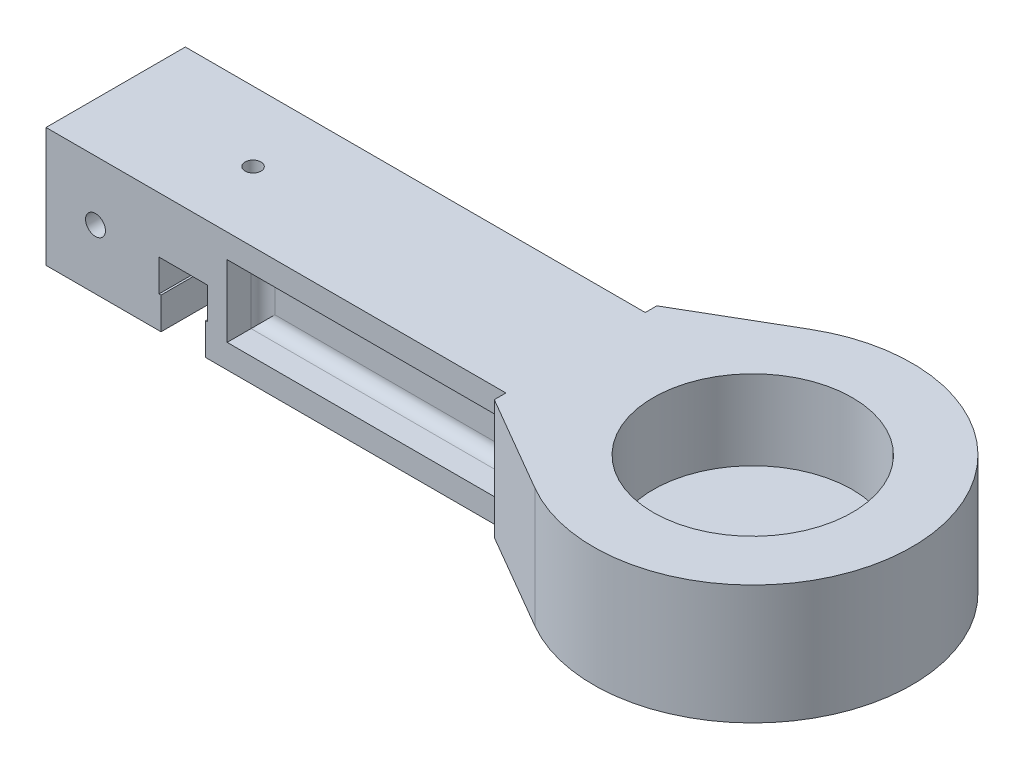
ISO-10303-21;
HEADER;
FILE_DESCRIPTION(('STEP AP214'),'2;1');
FILE_NAME('part.step','',(''),(''),'','','');
FILE_SCHEMA(('AUTOMOTIVE_DESIGN { 1 0 10303 214 1 1 1 1 }'));
ENDSEC;
DATA;
#1=APPLICATION_CONTEXT('core data for automotive mechanical design processes');
#2=APPLICATION_PROTOCOL_DEFINITION('international standard','automotive_design',2000,#1);
#3=PRODUCT_CONTEXT('',#1,'mechanical');
#4=PRODUCT('Part','Part','',(#3));
#5=PRODUCT_RELATED_PRODUCT_CATEGORY('part','',(#4));
#6=PRODUCT_DEFINITION_FORMATION('','',#4);
#7=PRODUCT_DEFINITION_CONTEXT('part definition',#1,'design');
#8=PRODUCT_DEFINITION('design','',#6,#7);
#9=PRODUCT_DEFINITION_SHAPE('','',#8);
#10=(LENGTH_UNIT() NAMED_UNIT(*) SI_UNIT(.MILLI.,.METRE.));
#11=(NAMED_UNIT(*) PLANE_ANGLE_UNIT() SI_UNIT($,.RADIAN.));
#12=(NAMED_UNIT(*) SI_UNIT($,.STERADIAN.) SOLID_ANGLE_UNIT());
#13=UNCERTAINTY_MEASURE_WITH_UNIT(LENGTH_MEASURE(1.E-05),#10,'distance_accuracy_value','');
#14=(GEOMETRIC_REPRESENTATION_CONTEXT(3) GLOBAL_UNCERTAINTY_ASSIGNED_CONTEXT((#13)) GLOBAL_UNIT_ASSIGNED_CONTEXT((#10,
#11,#12)) REPRESENTATION_CONTEXT('',''));
#15=CARTESIAN_POINT('',(0.,0.,0.));
#16=DIRECTION('',(0.,0.,1.));
#17=DIRECTION('',(1.,0.,0.));
#18=AXIS2_PLACEMENT_3D('',#15,#16,#17);
#19=CARTESIAN_POINT('',(-55.4989459475582,91.5559696739877,-40.0100000000001));
#20=DIRECTION('',(-1.,0.,0.));
#21=DIRECTION('',(0.,-1.,0.));
#22=AXIS2_PLACEMENT_3D('',#19,#20,#21);
#23=PLANE('',#22);
#24=DIRECTION('',(0.,1.,0.));
#25=VECTOR('',#24,1.);
#26=CARTESIAN_POINT('',(-55.4989459475582,30.,17.5));
#27=LINE('',#26,#25);
#28=CARTESIAN_POINT('',(-55.4989459475582,0.,17.5));
#29=VERTEX_POINT('',#28);
#30=CARTESIAN_POINT('',(-55.4989459475582,30.,17.5));
#31=VERTEX_POINT('',#30);
#32=EDGE_CURVE('E383',#29,#31,#27,.T.);
#33=ORIENTED_EDGE('',*,*,#32,.T.);
#34=DIRECTION('',(0.,0.,-1.));
#35=VECTOR('',#34,1.);
#36=CARTESIAN_POINT('',(-55.4989459475582,30.,0.));
#37=LINE('',#36,#35);
#38=CARTESIAN_POINT('',(-55.4989459475582,30.,-17.5));
#39=VERTEX_POINT('',#38);
#40=EDGE_CURVE('E269',#31,#39,#37,.T.);
#41=ORIENTED_EDGE('',*,*,#40,.T.);
#42=DIRECTION('',(0.,1.,0.));
#43=VECTOR('',#42,1.);
#44=CARTESIAN_POINT('',(-55.4989459475582,30.,-17.5));
#45=LINE('',#44,#43);
#46=CARTESIAN_POINT('',(-55.4989459475582,0.,-17.5));
#47=VERTEX_POINT('',#46);
#48=EDGE_CURVE('E380',#47,#39,#45,.T.);
#49=ORIENTED_EDGE('',*,*,#48,.F.);
#50=DIRECTION('',(0.,0.,-1.));
#51=VECTOR('',#50,1.);
#52=CARTESIAN_POINT('',(-55.4989459475582,0.,0.));
#53=LINE('',#52,#51);
#54=EDGE_CURVE('E280',#29,#47,#53,.T.);
#55=ORIENTED_EDGE('',*,*,#54,.F.);
#56=EDGE_LOOP('',(#33,#41,#49,#55));
#57=FACE_BOUND('',#56,.T.);
#58=ADVANCED_FACE('F33',(#57),#23,.T.);
#59=CARTESIAN_POINT('',(-21.,8.,-7.04367328411343));
#60=DIRECTION('',(-0.5,0.,-0.866025403784439));
#61=DIRECTION('',(-0.866025403784439,0.,0.5));
#62=AXIS2_PLACEMENT_3D('',#59,#60,#61);
#63=PLANE('',#62);
#64=DIRECTION('',(0.,1.,0.));
#65=VECTOR('',#64,1.);
#66=CARTESIAN_POINT('',(-21.,8.,-7.04367328411343));
#67=LINE('',#66,#65);
#68=CARTESIAN_POINT('',(-21.,8.,-7.04367328411343));
#69=VERTEX_POINT('',#68);
#70=CARTESIAN_POINT('',(-21.,16.,-7.04367328411343));
#71=VERTEX_POINT('',#70);
#72=EDGE_CURVE('E293',#69,#71,#67,.T.);
#73=ORIENTED_EDGE('',*,*,#72,.T.);
#74=DIRECTION('',(-0.866025403784439,0.,0.5));
#75=VECTOR('',#74,1.);
#76=CARTESIAN_POINT('',(-21.,16.,-7.04367328411343));
#77=LINE('',#76,#75);
#78=CARTESIAN_POINT('',(-27.1,16.,-3.52183664205672));
#79=VERTEX_POINT('',#78);
#80=EDGE_CURVE('E311',#71,#79,#77,.T.);
#81=ORIENTED_EDGE('',*,*,#80,.T.);
#82=DIRECTION('',(0.,1.,0.));
#83=VECTOR('',#82,1.);
#84=CARTESIAN_POINT('',(-27.1,8.,-3.52183664205672));
#85=LINE('',#84,#83);
#86=CARTESIAN_POINT('',(-27.1,8.,-3.52183664205672));
#87=VERTEX_POINT('',#86);
#88=EDGE_CURVE('E284',#87,#79,#85,.T.);
#89=ORIENTED_EDGE('',*,*,#88,.F.);
#90=DIRECTION('',(-0.866025403784439,0.,0.5));
#91=VECTOR('',#90,1.);
#92=CARTESIAN_POINT('',(-21.,8.,-7.04367328411343));
#93=LINE('',#92,#91);
#94=EDGE_CURVE('E299',#69,#87,#93,.T.);
#95=ORIENTED_EDGE('',*,*,#94,.F.);
#96=EDGE_LOOP('',(#73,#81,#89,#95));
#97=FACE_BOUND('',#96,.T.);
#98=ADVANCED_FACE('F488',(#97),#63,.F.);
#99=CARTESIAN_POINT('',(-14.9,8.,-3.52183664205671));
#100=DIRECTION('',(0.5,0.,-0.866025403784439));
#101=DIRECTION('',(-0.866025403784439,0.,-0.5));
#102=AXIS2_PLACEMENT_3D('',#99,#100,#101);
#103=PLANE('',#102);
#104=DIRECTION('',(0.,1.,0.));
#105=VECTOR('',#104,1.);
#106=CARTESIAN_POINT('',(-14.9,8.,-3.52183664205671));
#107=LINE('',#106,#105);
#108=CARTESIAN_POINT('',(-14.9,8.,-3.52183664205671));
#109=VERTEX_POINT('',#108);
#110=CARTESIAN_POINT('',(-14.9,16.,-3.52183664205671));
#111=VERTEX_POINT('',#110);
#112=EDGE_CURVE('E289',#109,#111,#107,.T.);
#113=ORIENTED_EDGE('',*,*,#112,.T.);
#114=DIRECTION('',(-0.866025403784439,0.,-0.5));
#115=VECTOR('',#114,1.);
#116=CARTESIAN_POINT('',(-14.9,16.,-3.52183664205671));
#117=LINE('',#116,#115);
#118=EDGE_CURVE('E276',#111,#71,#117,.T.);
#119=ORIENTED_EDGE('',*,*,#118,.T.);
#120=ORIENTED_EDGE('',*,*,#72,.F.);
#121=DIRECTION('',(-0.866025403784439,0.,-0.5));
#122=VECTOR('',#121,1.);
#123=CARTESIAN_POINT('',(-14.9,8.,-3.52183664205671));
#124=LINE('',#123,#122);
#125=EDGE_CURVE('E302',#109,#69,#124,.T.);
#126=ORIENTED_EDGE('',*,*,#125,.F.);
#127=EDGE_LOOP('',(#113,#119,#120,#126));
#128=FACE_BOUND('',#127,.T.);
#129=ADVANCED_FACE('F490',(#128),#103,.F.);
#130=CARTESIAN_POINT('',(104.501054052442,10.,0.));
#131=DIRECTION('',(0.,1.,0.));
#132=DIRECTION('',(0.,0.,1.));
#133=AXIS2_PLACEMENT_3D('',#130,#131,#132);
#134=PLANE('',#133);
#135=CARTESIAN_POINT('',(104.501054052442,10.,0.));
#136=DIRECTION('',(0.,1.,0.));
#137=DIRECTION('',(0.,0.,1.));
#138=AXIS2_PLACEMENT_3D('',#135,#136,#137);
#139=CIRCLE('',#138,25.);
#140=CARTESIAN_POINT('',(104.501054052442,10.,25.));
#141=VERTEX_POINT('',#140);
#142=EDGE_CURVE('E366',#141,#141,#139,.T.);
#143=ORIENTED_EDGE('',*,*,#142,.T.);
#144=EDGE_LOOP('',(#143));
#145=FACE_BOUND('',#144,.T.);
#146=ADVANCED_FACE('F497',(#145),#134,.T.);
#147=CARTESIAN_POINT('',(-14.9,8.,3.52183664205672));
#148=DIRECTION('',(1.,0.,0.));
#149=DIRECTION('',(0.,0.,-1.));
#150=AXIS2_PLACEMENT_3D('',#147,#148,#149);
#151=PLANE('',#150);
#152=DIRECTION('',(0.,0.,-1.));
#153=VECTOR('',#152,1.);
#154=CARTESIAN_POINT('',(-14.9,16.,3.52183664205672));
#155=LINE('',#154,#153);
#156=CARTESIAN_POINT('',(-14.9,16.,17.5));
#157=VERTEX_POINT('',#156);
#158=EDGE_CURVE('E307',#157,#111,#155,.T.);
#159=ORIENTED_EDGE('',*,*,#158,.T.);
#160=ORIENTED_EDGE('',*,*,#112,.F.);
#161=DIRECTION('',(0.,0.,-1.));
#162=VECTOR('',#161,1.);
#163=CARTESIAN_POINT('',(-14.9,8.,3.52183664205672));
#164=LINE('',#163,#162);
#165=CARTESIAN_POINT('',(-14.9,8.,17.5));
#166=VERTEX_POINT('',#165);
#167=EDGE_CURVE('E305',#166,#109,#164,.T.);
#168=ORIENTED_EDGE('',*,*,#167,.F.);
#169=DIRECTION('',(0.,1.,0.));
#170=VECTOR('',#169,1.);
#171=CARTESIAN_POINT('',(-14.9,8.,17.5));
#172=LINE('',#171,#170);
#173=EDGE_CURVE('E327',#166,#157,#172,.T.);
#174=ORIENTED_EDGE('',*,*,#173,.T.);
#175=EDGE_LOOP('',(#159,#160,#168,#174));
#176=FACE_BOUND('',#175,.T.);
#177=ADVANCED_FACE('F518',(#176),#151,.F.);
#178=CARTESIAN_POINT('',(-38.,16.,11.0434775432545));
#179=DIRECTION('',(0.,-1.,0.));
#180=DIRECTION('',(0.,0.,-1.));
#181=AXIS2_PLACEMENT_3D('',#178,#179,#180);
#182=PLANE('',#181);
#183=CARTESIAN_POINT('',(-21.,16.,0.));
#184=DIRECTION('',(0.,-1.,0.));
#185=DIRECTION('',(0.,0.,-1.));
#186=AXIS2_PLACEMENT_3D('',#183,#184,#185);
#187=CIRCLE('',#186,2.);
#188=CARTESIAN_POINT('',(-21.,16.,-2.));
#189=VERTEX_POINT('',#188);
#190=EDGE_CURVE('E271',#189,#189,#187,.T.);
#191=ORIENTED_EDGE('',*,*,#190,.F.);
#192=EDGE_LOOP('',(#191));
#193=FACE_BOUND('',#192,.T.);
#194=ORIENTED_EDGE('',*,*,#158,.F.);
#195=DIRECTION('',(-1.,0.,0.));
#196=VECTOR('',#195,1.);
#197=CARTESIAN_POINT('',(-21.,16.,17.5));
#198=LINE('',#197,#196);
#199=CARTESIAN_POINT('',(-27.1,16.,17.5));
#200=VERTEX_POINT('',#199);
#201=EDGE_CURVE('E324',#157,#200,#198,.T.);
#202=ORIENTED_EDGE('',*,*,#201,.T.);
#203=DIRECTION('',(0.,0.,1.));
#204=VECTOR('',#203,1.);
#205=CARTESIAN_POINT('',(-27.1,16.,-3.52183664205672));
#206=LINE('',#205,#204);
#207=EDGE_CURVE('E309',#79,#200,#206,.T.);
#208=ORIENTED_EDGE('',*,*,#207,.F.);
#209=ORIENTED_EDGE('',*,*,#80,.F.);
#210=ORIENTED_EDGE('',*,*,#118,.F.);
#211=EDGE_LOOP('',(#194,#202,#208,#209,#210));
#212=FACE_BOUND('',#211,.T.);
#213=ADVANCED_FACE('F510',(#193,#212),#182,.T.);
#214=CARTESIAN_POINT('',(-27.1,8.,-3.52183664205672));
#215=DIRECTION('',(-1.,0.,0.));
#216=DIRECTION('',(0.,0.,1.));
#217=AXIS2_PLACEMENT_3D('',#214,#215,#216);
#218=PLANE('',#217);
#219=DIRECTION('',(0.,-1.,0.));
#220=VECTOR('',#219,1.);
#221=CARTESIAN_POINT('',(-27.1,8.,17.5));
#222=LINE('',#221,#220);
#223=CARTESIAN_POINT('',(-27.1,8.,17.5));
#224=VERTEX_POINT('',#223);
#225=EDGE_CURVE('E275',#200,#224,#222,.T.);
#226=ORIENTED_EDGE('',*,*,#225,.T.);
#227=DIRECTION('',(0.,0.,1.));
#228=VECTOR('',#227,1.);
#229=CARTESIAN_POINT('',(-27.1,8.,-3.52183664205672));
#230=LINE('',#229,#228);
#231=EDGE_CURVE('E292',#87,#224,#230,.T.);
#232=ORIENTED_EDGE('',*,*,#231,.F.);
#233=ORIENTED_EDGE('',*,*,#88,.T.);
#234=ORIENTED_EDGE('',*,*,#207,.T.);
#235=EDGE_LOOP('',(#226,#232,#233,#234));
#236=FACE_BOUND('',#235,.T.);
#237=ADVANCED_FACE('F506',(#236),#218,.F.);
#238=CARTESIAN_POINT('',(0.,8.,0.));
#239=DIRECTION('',(0.,1.,0.));
#240=DIRECTION('',(0.,0.,1.));
#241=AXIS2_PLACEMENT_3D('',#238,#239,#240);
#242=PLANE('',#241);
#243=DIRECTION('',(0.,0.,1.));
#244=VECTOR('',#243,1.);
#245=CARTESIAN_POINT('',(-15.4,8.,0.));
#246=LINE('',#245,#244);
#247=CARTESIAN_POINT('',(-15.4,8.,0.));
#248=VERTEX_POINT('',#247);
#249=CARTESIAN_POINT('',(-15.4,8.,17.5));
#250=VERTEX_POINT('',#249);
#251=EDGE_CURVE('E314',#248,#250,#246,.T.);
#252=ORIENTED_EDGE('',*,*,#251,.T.);
#253=DIRECTION('',(1.,0.,0.));
#254=VECTOR('',#253,1.);
#255=CARTESIAN_POINT('',(-15.4,8.,17.5));
#256=LINE('',#255,#254);
#257=EDGE_CURVE('E331',#250,#166,#256,.T.);
#258=ORIENTED_EDGE('',*,*,#257,.T.);
#259=ORIENTED_EDGE('',*,*,#167,.T.);
#260=ORIENTED_EDGE('',*,*,#125,.T.);
#261=ORIENTED_EDGE('',*,*,#94,.T.);
#262=ORIENTED_EDGE('',*,*,#231,.T.);
#263=DIRECTION('',(1.,0.,0.));
#264=VECTOR('',#263,1.);
#265=CARTESIAN_POINT('',(-27.1,8.,17.5));
#266=LINE('',#265,#264);
#267=CARTESIAN_POINT('',(-26.6,8.,17.5));
#268=VERTEX_POINT('',#267);
#269=EDGE_CURVE('E340',#224,#268,#266,.T.);
#270=ORIENTED_EDGE('',*,*,#269,.T.);
#271=DIRECTION('',(0.,0.,1.));
#272=VECTOR('',#271,1.);
#273=CARTESIAN_POINT('',(-26.6,8.,0.));
#274=LINE('',#273,#272);
#275=CARTESIAN_POINT('',(-26.6,8.,0.));
#276=VERTEX_POINT('',#275);
#277=EDGE_CURVE('E315',#276,#268,#274,.T.);
#278=ORIENTED_EDGE('',*,*,#277,.F.);
#279=CARTESIAN_POINT('',(-21.,8.,0.));
#280=DIRECTION('',(0.,1.,0.));
#281=DIRECTION('',(0.,0.,1.));
#282=AXIS2_PLACEMENT_3D('',#279,#280,#281);
#283=CIRCLE('',#282,5.6);
#284=EDGE_CURVE('E281',#276,#248,#283,.F.);
#285=ORIENTED_EDGE('',*,*,#284,.T.);
#286=EDGE_LOOP('',(#252,#258,#259,#260,#261,#262,#270,#278,#285));
#287=FACE_BOUND('',#286,.T.);
#288=ADVANCED_FACE('F509',(#287),#242,.T.);
#289=CARTESIAN_POINT('',(-26.6,8.,0.));
#290=DIRECTION('',(-1.,0.,0.));
#291=DIRECTION('',(0.,0.,1.));
#292=AXIS2_PLACEMENT_3D('',#289,#290,#291);
#293=PLANE('',#292);
#294=DIRECTION('',(0.,-1.,0.));
#295=VECTOR('',#294,1.);
#296=CARTESIAN_POINT('',(-26.6,8.,17.5));
#297=LINE('',#296,#295);
#298=CARTESIAN_POINT('',(-26.6,0.,17.5));
#299=VERTEX_POINT('',#298);
#300=EDGE_CURVE('E337',#268,#299,#297,.T.);
#301=ORIENTED_EDGE('',*,*,#300,.T.);
#302=DIRECTION('',(0.,0.,1.));
#303=VECTOR('',#302,1.);
#304=CARTESIAN_POINT('',(-26.6,0.,0.));
#305=LINE('',#304,#303);
#306=CARTESIAN_POINT('',(-26.6,0.,0.));
#307=VERTEX_POINT('',#306);
#308=EDGE_CURVE('E318',#307,#299,#305,.T.);
#309=ORIENTED_EDGE('',*,*,#308,.F.);
#310=DIRECTION('',(0.,-1.,0.));
#311=VECTOR('',#310,1.);
#312=CARTESIAN_POINT('',(-26.6,8.,0.));
#313=LINE('',#312,#311);
#314=EDGE_CURVE('E328',#276,#307,#313,.T.);
#315=ORIENTED_EDGE('',*,*,#314,.F.);
#316=ORIENTED_EDGE('',*,*,#277,.T.);
#317=EDGE_LOOP('',(#301,#309,#315,#316));
#318=FACE_BOUND('',#317,.T.);
#319=ADVANCED_FACE('F514',(#318),#293,.F.);
#320=CARTESIAN_POINT('',(-21.,30.,0.));
#321=DIRECTION('',(0.,-1.,0.));
#322=DIRECTION('',(0.,0.,-1.));
#323=AXIS2_PLACEMENT_3D('',#320,#321,#322);
#324=CYLINDRICAL_SURFACE('',#323,5.6);
#325=ORIENTED_EDGE('',*,*,#314,.T.);
#326=CARTESIAN_POINT('',(-21.,0.,0.));
#327=DIRECTION('',(0.,-1.,0.));
#328=DIRECTION('',(0.,0.,-1.));
#329=AXIS2_PLACEMENT_3D('',#326,#327,#328);
#330=CIRCLE('',#329,5.6);
#331=CARTESIAN_POINT('',(-15.4,0.,0.));
#332=VERTEX_POINT('',#331);
#333=EDGE_CURVE('E285',#307,#332,#330,.T.);
#334=ORIENTED_EDGE('',*,*,#333,.T.);
#335=DIRECTION('',(0.,1.,0.));
#336=VECTOR('',#335,1.);
#337=CARTESIAN_POINT('',(-15.4,0.,0.));
#338=LINE('',#337,#336);
#339=EDGE_CURVE('E317',#332,#248,#338,.T.);
#340=ORIENTED_EDGE('',*,*,#339,.T.);
#341=ORIENTED_EDGE('',*,*,#284,.F.);
#342=EDGE_LOOP('',(#325,#334,#340,#341));
#343=FACE_BOUND('',#342,.T.);
#344=ADVANCED_FACE('F522',(#343),#324,.F.);
#345=CARTESIAN_POINT('',(-15.4,0.,0.));
#346=DIRECTION('',(1.,0.,0.));
#347=DIRECTION('',(0.,0.,-1.));
#348=AXIS2_PLACEMENT_3D('',#345,#346,#347);
#349=PLANE('',#348);
#350=DIRECTION('',(0.,1.,0.));
#351=VECTOR('',#350,1.);
#352=CARTESIAN_POINT('',(-15.4,0.,17.5));
#353=LINE('',#352,#351);
#354=CARTESIAN_POINT('',(-15.4,0.,17.5));
#355=VERTEX_POINT('',#354);
#356=EDGE_CURVE('E334',#355,#250,#353,.T.);
#357=ORIENTED_EDGE('',*,*,#356,.T.);
#358=ORIENTED_EDGE('',*,*,#251,.F.);
#359=ORIENTED_EDGE('',*,*,#339,.F.);
#360=DIRECTION('',(0.,0.,1.));
#361=VECTOR('',#360,1.);
#362=CARTESIAN_POINT('',(-15.4,0.,0.));
#363=LINE('',#362,#361);
#364=EDGE_CURVE('E321',#332,#355,#363,.T.);
#365=ORIENTED_EDGE('',*,*,#364,.T.);
#366=EDGE_LOOP('',(#357,#358,#359,#365));
#367=FACE_BOUND('',#366,.T.);
#368=ADVANCED_FACE('F524',(#367),#349,.F.);
#369=CARTESIAN_POINT('',(55.,0.,17.4999999999999));
#370=DIRECTION('',(-0.50238861787355,0.,0.864641935503422));
#371=DIRECTION('',(0.864641935503422,0.,0.50238861787355));
#372=AXIS2_PLACEMENT_3D('',#369,#370,#371);
#373=PLANE('',#372);
#374=DIRECTION('',(0.,1.,0.));
#375=VECTOR('',#374,1.);
#376=CARTESIAN_POINT('',(60.,0.,20.4051830430884));
#377=LINE('',#376,#375);
#378=CARTESIAN_POINT('',(60.,0.,20.4051830430884));
#379=VERTEX_POINT('',#378);
#380=CARTESIAN_POINT('',(60.,30.,20.4051830430884));
#381=VERTEX_POINT('',#380);
#382=EDGE_CURVE('E256',#379,#381,#377,.T.);
#383=ORIENTED_EDGE('',*,*,#382,.F.);
#384=DIRECTION('',(0.864641935503422,0.,0.50238861787355));
#385=VECTOR('',#384,1.);
#386=CARTESIAN_POINT('',(55.,0.,17.4999999999999));
#387=LINE('',#386,#385);
#388=CARTESIAN_POINT('',(84.4055093374998,0.,34.5856774201368));
#389=VERTEX_POINT('',#388);
#390=EDGE_CURVE('E369',#379,#389,#387,.T.);
#391=ORIENTED_EDGE('',*,*,#390,.T.);
#392=DIRECTION('',(0.,1.,0.));
#393=VECTOR('',#392,1.);
#394=CARTESIAN_POINT('',(84.4055093374998,0.,34.5856774201368));
#395=LINE('',#394,#393);
#396=CARTESIAN_POINT('',(84.4055093374998,30.,34.5856774201368));
#397=VERTEX_POINT('',#396);
#398=EDGE_CURVE('E352',#389,#397,#395,.T.);
#399=ORIENTED_EDGE('',*,*,#398,.T.);
#400=DIRECTION('',(0.864641935503422,0.,0.50238861787355));
#401=VECTOR('',#400,1.);
#402=CARTESIAN_POINT('',(55.,30.,17.4999999999999));
#403=LINE('',#402,#401);
#404=EDGE_CURVE('E360',#381,#397,#403,.T.);
#405=ORIENTED_EDGE('',*,*,#404,.F.);
#406=EDGE_LOOP('',(#383,#391,#399,#405));
#407=FACE_BOUND('',#406,.T.);
#408=ADVANCED_FACE('F527',(#407),#373,.T.);
#409=CARTESIAN_POINT('',(104.501054052442,0.,0.));
#410=DIRECTION('',(0.,1.,0.));
#411=DIRECTION('',(0.,0.,1.));
#412=AXIS2_PLACEMENT_3D('',#409,#410,#411);
#413=CYLINDRICAL_SURFACE('',#412,40.);
#414=CARTESIAN_POINT('',(104.501054052442,30.,0.));
#415=DIRECTION('',(0.,1.,0.));
#416=DIRECTION('',(0.,0.,1.));
#417=AXIS2_PLACEMENT_3D('',#414,#415,#416);
#418=CIRCLE('',#417,40.);
#419=CARTESIAN_POINT('',(84.4055093374998,30.,-34.5856774201369));
#420=VERTEX_POINT('',#419);
#421=EDGE_CURVE('E357',#397,#420,#418,.T.);
#422=ORIENTED_EDGE('',*,*,#421,.F.);
#423=ORIENTED_EDGE('',*,*,#398,.F.);
#424=CARTESIAN_POINT('',(104.501054052442,0.,0.));
#425=DIRECTION('',(0.,1.,0.));
#426=DIRECTION('',(0.,0.,1.));
#427=AXIS2_PLACEMENT_3D('',#424,#425,#426);
#428=CIRCLE('',#427,40.);
#429=CARTESIAN_POINT('',(84.4055093374998,0.,-34.5856774201369));
#430=VERTEX_POINT('',#429);
#431=EDGE_CURVE('E355',#389,#430,#428,.T.);
#432=ORIENTED_EDGE('',*,*,#431,.T.);
#433=DIRECTION('',(0.,1.,0.));
#434=VECTOR('',#433,1.);
#435=CARTESIAN_POINT('',(84.4055093374998,0.,-34.5856774201369));
#436=LINE('',#435,#434);
#437=EDGE_CURVE('E351',#430,#420,#436,.T.);
#438=ORIENTED_EDGE('',*,*,#437,.T.);
#439=EDGE_LOOP('',(#422,#423,#432,#438));
#440=FACE_BOUND('',#439,.T.);
#441=ADVANCED_FACE('F538',(#440),#413,.T.);
#442=CARTESIAN_POINT('',(84.4055093374998,0.,-34.5856774201369));
#443=DIRECTION('',(-0.502388617873549,0.,-0.864641935503422));
#444=DIRECTION('',(-0.864641935503423,0.,0.502388617873549));
#445=AXIS2_PLACEMENT_3D('',#442,#443,#444);
#446=PLANE('',#445);
#447=DIRECTION('',(0.,-1.,0.));
#448=VECTOR('',#447,1.);
#449=CARTESIAN_POINT('',(60.,0.,-20.4051830430885));
#450=LINE('',#449,#448);
#451=CARTESIAN_POINT('',(60.,30.,-20.4051830430885));
#452=VERTEX_POINT('',#451);
#453=CARTESIAN_POINT('',(60.,0.,-20.4051830430885));
#454=VERTEX_POINT('',#453);
#455=EDGE_CURVE('E263',#452,#454,#450,.T.);
#456=ORIENTED_EDGE('',*,*,#455,.F.);
#457=DIRECTION('',(-0.864641935503423,0.,0.502388617873549));
#458=VECTOR('',#457,1.);
#459=CARTESIAN_POINT('',(84.4055093374998,30.,-34.5856774201369));
#460=LINE('',#459,#458);
#461=EDGE_CURVE('E363',#420,#452,#460,.T.);
#462=ORIENTED_EDGE('',*,*,#461,.F.);
#463=ORIENTED_EDGE('',*,*,#437,.F.);
#464=DIRECTION('',(-0.864641935503423,0.,0.502388617873549));
#465=VECTOR('',#464,1.);
#466=CARTESIAN_POINT('',(84.4055093374998,0.,-34.5856774201369));
#467=LINE('',#466,#465);
#468=EDGE_CURVE('E361',#430,#454,#467,.T.);
#469=ORIENTED_EDGE('',*,*,#468,.T.);
#470=EDGE_LOOP('',(#456,#462,#463,#469));
#471=FACE_BOUND('',#470,.T.);
#472=ADVANCED_FACE('F534',(#471),#446,.T.);
#473=CARTESIAN_POINT('',(-247.,30.,-17.5));
#474=DIRECTION('',(0.,0.,-1.));
#475=DIRECTION('',(-1.,0.,0.));
#476=AXIS2_PLACEMENT_3D('',#473,#474,#475);
#477=PLANE('',#476);
#478=DIRECTION('',(-1.,0.,0.));
#479=VECTOR('',#478,1.);
#480=CARTESIAN_POINT('',(60.,24.,-17.5));
#481=LINE('',#480,#479);
#482=CARTESIAN_POINT('',(60.,24.,-17.5));
#483=VERTEX_POINT('',#482);
#484=CARTESIAN_POINT('',(-10.,24.,-17.5));
#485=VERTEX_POINT('',#484);
#486=EDGE_CURVE('E948',#483,#485,#481,.T.);
#487=ORIENTED_EDGE('',*,*,#486,.T.);
#488=DIRECTION('',(0.,-1.,0.));
#489=VECTOR('',#488,1.);
#490=CARTESIAN_POINT('',(-10.,30.,-17.5));
#491=LINE('',#490,#489);
#492=CARTESIAN_POINT('',(-10.,6.,-17.5));
#493=VERTEX_POINT('',#492);
#494=EDGE_CURVE('E253',#485,#493,#491,.T.);
#495=ORIENTED_EDGE('',*,*,#494,.T.);
#496=DIRECTION('',(-1.,0.,0.));
#497=VECTOR('',#496,1.);
#498=CARTESIAN_POINT('',(60.,6.,-17.5));
#499=LINE('',#498,#497);
#500=CARTESIAN_POINT('',(60.,6.,-17.5));
#501=VERTEX_POINT('',#500);
#502=EDGE_CURVE('E248',#501,#493,#499,.T.);
#503=ORIENTED_EDGE('',*,*,#502,.F.);
#504=DIRECTION('',(0.,1.,0.));
#505=VECTOR('',#504,1.);
#506=CARTESIAN_POINT('',(60.,0.,-17.5));
#507=LINE('',#506,#505);
#508=CARTESIAN_POINT('',(60.,0.,-17.5));
#509=VERTEX_POINT('',#508);
#510=EDGE_CURVE('E939',#509,#501,#507,.T.);
#511=ORIENTED_EDGE('',*,*,#510,.F.);
#512=DIRECTION('',(1.,0.,0.));
#513=VECTOR('',#512,1.);
#514=CARTESIAN_POINT('',(-247.,0.,-17.5));
#515=LINE('',#514,#513);
#516=EDGE_CURVE('E288',#47,#509,#515,.T.);
#517=ORIENTED_EDGE('',*,*,#516,.F.);
#518=ORIENTED_EDGE('',*,*,#48,.T.);
#519=DIRECTION('',(1.,0.,0.));
#520=VECTOR('',#519,1.);
#521=CARTESIAN_POINT('',(-247.,30.,-17.5));
#522=LINE('',#521,#520);
#523=CARTESIAN_POINT('',(60.,30.,-17.5));
#524=VERTEX_POINT('',#523);
#525=EDGE_CURVE('E389',#39,#524,#522,.T.);
#526=ORIENTED_EDGE('',*,*,#525,.T.);
#527=DIRECTION('',(0.,1.,0.));
#528=VECTOR('',#527,1.);
#529=CARTESIAN_POINT('',(60.,24.,-17.5));
#530=LINE('',#529,#528);
#531=EDGE_CURVE('E930',#483,#524,#530,.T.);
#532=ORIENTED_EDGE('',*,*,#531,.F.);
#533=EDGE_LOOP('',(#487,#495,#503,#511,#517,#518,#526,#532));
#534=FACE_BOUND('',#533,.T.);
#535=CARTESIAN_POINT('',(-43.0740192619808,15.,-17.5));
#536=DIRECTION('',(0.,0.,-1.));
#537=DIRECTION('',(-1.,0.,0.));
#538=AXIS2_PLACEMENT_3D('',#535,#536,#537);
#539=CIRCLE('',#538,2.5);
#540=CARTESIAN_POINT('',(-45.5740192619808,15.,-17.5));
#541=VERTEX_POINT('',#540);
#542=EDGE_CURVE('E266',#541,#541,#539,.T.);
#543=ORIENTED_EDGE('',*,*,#542,.F.);
#544=EDGE_LOOP('',(#543));
#545=FACE_BOUND('',#544,.T.);
#546=ADVANCED_FACE('F537',(#534,#545),#477,.T.);
#547=CARTESIAN_POINT('',(-247.,30.,17.5));
#548=DIRECTION('',(0.,0.,-1.));
#549=DIRECTION('',(-1.,0.,0.));
#550=AXIS2_PLACEMENT_3D('',#547,#548,#549);
#551=PLANE('',#550);
#552=DIRECTION('',(1.,0.,0.));
#553=VECTOR('',#552,1.);
#554=CARTESIAN_POINT('',(-247.,0.,17.5));
#555=LINE('',#554,#553);
#556=CARTESIAN_POINT('',(60.,0.,17.5));
#557=VERTEX_POINT('',#556);
#558=EDGE_CURVE('E393',#355,#557,#555,.T.);
#559=ORIENTED_EDGE('',*,*,#558,.T.);
#560=DIRECTION('',(0.,-1.,0.));
#561=VECTOR('',#560,1.);
#562=CARTESIAN_POINT('',(60.,6.,17.5));
#563=LINE('',#562,#561);
#564=CARTESIAN_POINT('',(60.,6.,17.5));
#565=VERTEX_POINT('',#564);
#566=EDGE_CURVE('E247',#565,#557,#563,.T.);
#567=ORIENTED_EDGE('',*,*,#566,.F.);
#568=DIRECTION('',(-1.,0.,0.));
#569=VECTOR('',#568,1.);
#570=CARTESIAN_POINT('',(60.,6.,17.5));
#571=LINE('',#570,#569);
#572=CARTESIAN_POINT('',(-10.,6.,17.5));
#573=VERTEX_POINT('',#572);
#574=EDGE_CURVE('E230',#565,#573,#571,.T.);
#575=ORIENTED_EDGE('',*,*,#574,.T.);
#576=DIRECTION('',(0.,-1.,0.));
#577=VECTOR('',#576,1.);
#578=CARTESIAN_POINT('',(-10.,30.,17.5));
#579=LINE('',#578,#577);
#580=CARTESIAN_POINT('',(-10.,24.,17.5));
#581=VERTEX_POINT('',#580);
#582=EDGE_CURVE('E245',#581,#573,#579,.T.);
#583=ORIENTED_EDGE('',*,*,#582,.F.);
#584=DIRECTION('',(-1.,0.,0.));
#585=VECTOR('',#584,1.);
#586=CARTESIAN_POINT('',(60.,24.,17.5));
#587=LINE('',#586,#585);
#588=CARTESIAN_POINT('',(60.,24.,17.5));
#589=VERTEX_POINT('',#588);
#590=EDGE_CURVE('E929',#589,#581,#587,.T.);
#591=ORIENTED_EDGE('',*,*,#590,.F.);
#592=DIRECTION('',(0.,-1.,0.));
#593=VECTOR('',#592,1.);
#594=CARTESIAN_POINT('',(60.,30.,17.5));
#595=LINE('',#594,#593);
#596=CARTESIAN_POINT('',(60.,30.,17.5));
#597=VERTEX_POINT('',#596);
#598=EDGE_CURVE('E926',#597,#589,#595,.T.);
#599=ORIENTED_EDGE('',*,*,#598,.F.);
#600=DIRECTION('',(1.,0.,0.));
#601=VECTOR('',#600,1.);
#602=CARTESIAN_POINT('',(-247.,30.,17.5));
#603=LINE('',#602,#601);
#604=EDGE_CURVE('E279',#31,#597,#603,.T.);
#605=ORIENTED_EDGE('',*,*,#604,.F.);
#606=ORIENTED_EDGE('',*,*,#32,.F.);
#607=EDGE_CURVE('E391',#29,#299,#555,.T.);
#608=ORIENTED_EDGE('',*,*,#607,.T.);
#609=ORIENTED_EDGE('',*,*,#300,.F.);
#610=ORIENTED_EDGE('',*,*,#269,.F.);
#611=ORIENTED_EDGE('',*,*,#225,.F.);
#612=ORIENTED_EDGE('',*,*,#201,.F.);
#613=ORIENTED_EDGE('',*,*,#173,.F.);
#614=ORIENTED_EDGE('',*,*,#257,.F.);
#615=ORIENTED_EDGE('',*,*,#356,.F.);
#616=EDGE_LOOP('',(#559,#567,#575,#583,#591,#599,#605,#606,#608,#609,#610,#611,#612,#613,#614,#615));
#617=FACE_BOUND('',#616,.T.);
#618=CARTESIAN_POINT('',(-43.0740192619808,15.,17.5));
#619=DIRECTION('',(0.,0.,-1.));
#620=DIRECTION('',(-1.,0.,0.));
#621=AXIS2_PLACEMENT_3D('',#618,#619,#620);
#622=CIRCLE('',#621,2.5);
#623=CARTESIAN_POINT('',(-45.5740192619808,15.,17.5));
#624=VERTEX_POINT('',#623);
#625=EDGE_CURVE('E270',#624,#624,#622,.T.);
#626=ORIENTED_EDGE('',*,*,#625,.T.);
#627=EDGE_LOOP('',(#626));
#628=FACE_BOUND('',#627,.T.);
#629=ADVANCED_FACE('F243',(#617,#628),#551,.F.);
#630=CARTESIAN_POINT('',(0.,0.,0.));
#631=DIRECTION('',(0.,-1.,0.));
#632=DIRECTION('',(0.,0.,-1.));
#633=AXIS2_PLACEMENT_3D('',#630,#631,#632);
#634=PLANE('',#633);
#635=DIRECTION('',(0.,0.,1.));
#636=VECTOR('',#635,1.);
#637=CARTESIAN_POINT('',(60.,0.,0.));
#638=LINE('',#637,#636);
#639=EDGE_CURVE('E261',#557,#379,#638,.T.);
#640=ORIENTED_EDGE('',*,*,#639,.F.);
#641=ORIENTED_EDGE('',*,*,#558,.F.);
#642=ORIENTED_EDGE('',*,*,#364,.F.);
#643=ORIENTED_EDGE('',*,*,#333,.F.);
#644=ORIENTED_EDGE('',*,*,#308,.T.);
#645=ORIENTED_EDGE('',*,*,#607,.F.);
#646=ORIENTED_EDGE('',*,*,#54,.T.);
#647=ORIENTED_EDGE('',*,*,#516,.T.);
#648=EDGE_CURVE('E264',#454,#509,#638,.T.);
#649=ORIENTED_EDGE('',*,*,#648,.F.);
#650=ORIENTED_EDGE('',*,*,#468,.F.);
#651=ORIENTED_EDGE('',*,*,#431,.F.);
#652=ORIENTED_EDGE('',*,*,#390,.F.);
#653=EDGE_LOOP('',(#640,#641,#642,#643,#644,#645,#646,#647,#649,#650,#651,#652));
#654=FACE_BOUND('',#653,.T.);
#655=ADVANCED_FACE('F548',(#654),#634,.T.);
#656=CARTESIAN_POINT('',(104.501054052442,10.,0.));
#657=DIRECTION('',(0.,1.,0.));
#658=DIRECTION('',(0.,0.,1.));
#659=AXIS2_PLACEMENT_3D('',#656,#657,#658);
#660=CYLINDRICAL_SURFACE('',#659,25.);
#661=ORIENTED_EDGE('',*,*,#142,.F.);
#662=EDGE_LOOP('',(#661));
#663=FACE_BOUND('',#662,.T.);
#664=CARTESIAN_POINT('',(104.501054052442,30.,0.));
#665=DIRECTION('',(0.,1.,0.));
#666=DIRECTION('',(0.,0.,1.));
#667=AXIS2_PLACEMENT_3D('',#664,#665,#666);
#668=CIRCLE('',#667,25.);
#669=CARTESIAN_POINT('',(104.501054052442,30.,25.));
#670=VERTEX_POINT('',#669);
#671=EDGE_CURVE('E373',#670,#670,#668,.T.);
#672=ORIENTED_EDGE('',*,*,#671,.T.);
#673=EDGE_LOOP('',(#672));
#674=FACE_BOUND('',#673,.T.);
#675=ADVANCED_FACE('F532',(#663,#674),#660,.F.);
#676=CARTESIAN_POINT('',(-21.,-8.,0.));
#677=DIRECTION('',(0.,1.,0.));
#678=DIRECTION('',(0.,0.,1.));
#679=AXIS2_PLACEMENT_3D('',#676,#677,#678);
#680=CYLINDRICAL_SURFACE('',#679,2.);
#681=ORIENTED_EDGE('',*,*,#190,.T.);
#682=EDGE_LOOP('',(#681));
#683=FACE_BOUND('',#682,.T.);
#684=CARTESIAN_POINT('',(-21.,30.,0.));
#685=DIRECTION('',(0.,1.,0.));
#686=DIRECTION('',(0.,0.,1.));
#687=AXIS2_PLACEMENT_3D('',#684,#685,#686);
#688=CIRCLE('',#687,2.);
#689=CARTESIAN_POINT('',(-21.,30.,2.));
#690=VERTEX_POINT('',#689);
#691=EDGE_CURVE('E274',#690,#690,#688,.T.);
#692=ORIENTED_EDGE('',*,*,#691,.T.);
#693=EDGE_LOOP('',(#692));
#694=FACE_BOUND('',#693,.T.);
#695=ADVANCED_FACE('F529',(#683,#694),#680,.F.);
#696=CARTESIAN_POINT('',(0.,30.,0.));
#697=DIRECTION('',(0.,-1.,0.));
#698=DIRECTION('',(0.,0.,-1.));
#699=AXIS2_PLACEMENT_3D('',#696,#697,#698);
#700=PLANE('',#699);
#701=ORIENTED_EDGE('',*,*,#671,.F.);
#702=EDGE_LOOP('',(#701));
#703=FACE_BOUND('',#702,.T.);
#704=ORIENTED_EDGE('',*,*,#461,.T.);
#705=DIRECTION('',(0.,0.,1.));
#706=VECTOR('',#705,1.);
#707=CARTESIAN_POINT('',(60.,30.,0.));
#708=LINE('',#707,#706);
#709=EDGE_CURVE('E399',#452,#524,#708,.T.);
#710=ORIENTED_EDGE('',*,*,#709,.T.);
#711=ORIENTED_EDGE('',*,*,#525,.F.);
#712=ORIENTED_EDGE('',*,*,#40,.F.);
#713=ORIENTED_EDGE('',*,*,#604,.T.);
#714=EDGE_CURVE('E376',#597,#381,#708,.T.);
#715=ORIENTED_EDGE('',*,*,#714,.T.);
#716=ORIENTED_EDGE('',*,*,#404,.T.);
#717=ORIENTED_EDGE('',*,*,#421,.T.);
#718=EDGE_LOOP('',(#704,#710,#711,#712,#713,#715,#716,#717));
#719=FACE_BOUND('',#718,.T.);
#720=ORIENTED_EDGE('',*,*,#691,.F.);
#721=EDGE_LOOP('',(#720));
#722=FACE_BOUND('',#721,.T.);
#723=ADVANCED_FACE('F503',(#703,#719,#722),#700,.F.);
#724=CARTESIAN_POINT('',(-43.0740192619808,15.,40.));
#725=DIRECTION('',(0.,0.,-1.));
#726=DIRECTION('',(-1.,0.,0.));
#727=AXIS2_PLACEMENT_3D('',#724,#725,#726);
#728=CYLINDRICAL_SURFACE('',#727,2.5);
#729=ORIENTED_EDGE('',*,*,#542,.T.);
#730=EDGE_LOOP('',(#729));
#731=FACE_BOUND('',#730,.T.);
#732=ORIENTED_EDGE('',*,*,#625,.F.);
#733=EDGE_LOOP('',(#732));
#734=FACE_BOUND('',#733,.T.);
#735=ADVANCED_FACE('F502',(#731,#734),#728,.F.);
#736=CARTESIAN_POINT('',(60.,24.,8.5));
#737=DIRECTION('',(0.,0.,-1.));
#738=DIRECTION('',(-1.,0.,0.));
#739=AXIS2_PLACEMENT_3D('',#736,#737,#738);
#740=PLANE('',#739);
#741=DIRECTION('',(-1.,0.,0.));
#742=VECTOR('',#741,1.);
#743=CARTESIAN_POINT('',(-10.,21.,8.5));
#744=LINE('',#743,#742);
#745=CARTESIAN_POINT('',(57.,21.,8.5));
#746=VERTEX_POINT('',#745);
#747=CARTESIAN_POINT('',(-7.,21.,8.5));
#748=VERTEX_POINT('',#747);
#749=EDGE_CURVE('E404',#746,#748,#744,.T.);
#750=ORIENTED_EDGE('',*,*,#749,.T.);
#751=DIRECTION('',(0.,-1.,0.));
#752=VECTOR('',#751,1.);
#753=CARTESIAN_POINT('',(-7.,24.,8.5));
#754=LINE('',#753,#752);
#755=CARTESIAN_POINT('',(-7.,9.,8.5));
#756=VERTEX_POINT('',#755);
#757=EDGE_CURVE('E406',#748,#756,#754,.T.);
#758=ORIENTED_EDGE('',*,*,#757,.T.);
#759=DIRECTION('',(-1.,0.,0.));
#760=VECTOR('',#759,1.);
#761=CARTESIAN_POINT('',(60.,9.,8.5));
#762=LINE('',#761,#760);
#763=CARTESIAN_POINT('',(57.,9.,8.5));
#764=VERTEX_POINT('',#763);
#765=EDGE_CURVE('E400',#756,#764,#762,.F.);
#766=ORIENTED_EDGE('',*,*,#765,.T.);
#767=DIRECTION('',(0.,-1.,0.));
#768=VECTOR('',#767,1.);
#769=CARTESIAN_POINT('',(57.,24.,8.5));
#770=LINE('',#769,#768);
#771=EDGE_CURVE('E402',#764,#746,#770,.F.);
#772=ORIENTED_EDGE('',*,*,#771,.T.);
#773=EDGE_LOOP('',(#750,#758,#766,#772));
#774=FACE_BOUND('',#773,.T.);
#775=ADVANCED_FACE('F677',(#774),#740,.F.);
#776=CARTESIAN_POINT('',(-10.,0.,0.));
#777=DIRECTION('',(1.,0.,0.));
#778=DIRECTION('',(0.,0.,-1.));
#779=AXIS2_PLACEMENT_3D('',#776,#777,#778);
#780=PLANE('',#779);
#781=DIRECTION('',(0.,0.,1.));
#782=VECTOR('',#781,1.);
#783=CARTESIAN_POINT('',(-10.,6.,8.5));
#784=LINE('',#783,#782);
#785=CARTESIAN_POINT('',(-10.,6.,11.5));
#786=VERTEX_POINT('',#785);
#787=EDGE_CURVE('E226',#786,#573,#784,.T.);
#788=ORIENTED_EDGE('',*,*,#787,.F.);
#789=DIRECTION('',(0.,-1.,0.));
#790=VECTOR('',#789,1.);
#791=CARTESIAN_POINT('',(-10.,0.,11.5));
#792=LINE('',#791,#790);
#793=CARTESIAN_POINT('',(-10.,24.,11.5));
#794=VERTEX_POINT('',#793);
#795=EDGE_CURVE('E409',#786,#794,#792,.F.);
#796=ORIENTED_EDGE('',*,*,#795,.T.);
#797=DIRECTION('',(0.,0.,-1.));
#798=VECTOR('',#797,1.);
#799=CARTESIAN_POINT('',(-10.,24.,17.5));
#800=LINE('',#799,#798);
#801=EDGE_CURVE('E239',#581,#794,#800,.T.);
#802=ORIENTED_EDGE('',*,*,#801,.F.);
#803=ORIENTED_EDGE('',*,*,#582,.T.);
#804=EDGE_LOOP('',(#788,#796,#802,#803));
#805=FACE_BOUND('',#804,.T.);
#806=ADVANCED_FACE('F251',(#805),#780,.T.);
#807=CARTESIAN_POINT('',(60.,0.,0.));
#808=DIRECTION('',(1.,0.,0.));
#809=DIRECTION('',(0.,0.,-1.));
#810=AXIS2_PLACEMENT_3D('',#807,#808,#809);
#811=PLANE('',#810);
#812=DIRECTION('',(0.,0.,-1.));
#813=VECTOR('',#812,1.);
#814=CARTESIAN_POINT('',(60.,24.,17.5));
#815=LINE('',#814,#813);
#816=CARTESIAN_POINT('',(60.,24.,11.5));
#817=VERTEX_POINT('',#816);
#818=EDGE_CURVE('E471',#589,#817,#815,.T.);
#819=ORIENTED_EDGE('',*,*,#818,.T.);
#820=DIRECTION('',(0.,-1.,0.));
#821=VECTOR('',#820,1.);
#822=CARTESIAN_POINT('',(60.,6.,11.5));
#823=LINE('',#822,#821);
#824=CARTESIAN_POINT('',(60.,6.,11.5));
#825=VERTEX_POINT('',#824);
#826=EDGE_CURVE('E413',#817,#825,#823,.T.);
#827=ORIENTED_EDGE('',*,*,#826,.T.);
#828=DIRECTION('',(0.,0.,1.));
#829=VECTOR('',#828,1.);
#830=CARTESIAN_POINT('',(60.,6.,8.5));
#831=LINE('',#830,#829);
#832=EDGE_CURVE('E933',#825,#565,#831,.T.);
#833=ORIENTED_EDGE('',*,*,#832,.T.);
#834=ORIENTED_EDGE('',*,*,#566,.T.);
#835=ORIENTED_EDGE('',*,*,#639,.T.);
#836=ORIENTED_EDGE('',*,*,#382,.T.);
#837=ORIENTED_EDGE('',*,*,#714,.F.);
#838=ORIENTED_EDGE('',*,*,#598,.T.);
#839=EDGE_LOOP('',(#819,#827,#833,#834,#835,#836,#837,#838));
#840=FACE_BOUND('',#839,.T.);
#841=ADVANCED_FACE('F644',(#840),#811,.F.);
#842=CARTESIAN_POINT('',(60.,6.,8.5));
#843=DIRECTION('',(0.,-1.,0.));
#844=DIRECTION('',(0.,0.,-1.));
#845=AXIS2_PLACEMENT_3D('',#842,#843,#844);
#846=PLANE('',#845);
#847=ORIENTED_EDGE('',*,*,#832,.F.);
#848=DIRECTION('',(-1.,0.,0.));
#849=VECTOR('',#848,1.);
#850=CARTESIAN_POINT('',(-10.,6.,11.5));
#851=LINE('',#850,#849);
#852=EDGE_CURVE('E233',#825,#786,#851,.T.);
#853=ORIENTED_EDGE('',*,*,#852,.T.);
#854=ORIENTED_EDGE('',*,*,#787,.T.);
#855=ORIENTED_EDGE('',*,*,#574,.F.);
#856=EDGE_LOOP('',(#847,#853,#854,#855));
#857=FACE_BOUND('',#856,.T.);
#858=ADVANCED_FACE('F229',(#857),#846,.F.);
#859=CARTESIAN_POINT('',(60.,24.,17.5));
#860=DIRECTION('',(0.,1.,0.));
#861=DIRECTION('',(0.,0.,1.));
#862=AXIS2_PLACEMENT_3D('',#859,#860,#861);
#863=PLANE('',#862);
#864=ORIENTED_EDGE('',*,*,#801,.T.);
#865=DIRECTION('',(-1.,0.,0.));
#866=VECTOR('',#865,1.);
#867=CARTESIAN_POINT('',(60.,24.,11.5));
#868=LINE('',#867,#866);
#869=EDGE_CURVE('E411',#794,#817,#868,.F.);
#870=ORIENTED_EDGE('',*,*,#869,.T.);
#871=ORIENTED_EDGE('',*,*,#818,.F.);
#872=ORIENTED_EDGE('',*,*,#590,.T.);
#873=EDGE_LOOP('',(#864,#870,#871,#872));
#874=FACE_BOUND('',#873,.T.);
#875=ADVANCED_FACE('F642',(#874),#863,.F.);
#876=DIRECTION('',(0.,0.,1.));
#877=VECTOR('',#876,1.);
#878=CARTESIAN_POINT('',(60.,6.,-17.5));
#879=LINE('',#878,#877);
#880=CARTESIAN_POINT('',(60.,6.,-11.5));
#881=VERTEX_POINT('',#880);
#882=EDGE_CURVE('E942',#501,#881,#879,.T.);
#883=ORIENTED_EDGE('',*,*,#882,.T.);
#884=DIRECTION('',(0.,1.,0.));
#885=VECTOR('',#884,1.);
#886=CARTESIAN_POINT('',(60.,24.,-11.5));
#887=LINE('',#886,#885);
#888=CARTESIAN_POINT('',(60.,24.,-11.5));
#889=VERTEX_POINT('',#888);
#890=EDGE_CURVE('E42',#881,#889,#887,.T.);
#891=ORIENTED_EDGE('',*,*,#890,.T.);
#892=DIRECTION('',(0.,0.,-1.));
#893=VECTOR('',#892,1.);
#894=CARTESIAN_POINT('',(60.,24.,-8.5));
#895=LINE('',#894,#893);
#896=EDGE_CURVE('E465',#889,#483,#895,.T.);
#897=ORIENTED_EDGE('',*,*,#896,.T.);
#898=ORIENTED_EDGE('',*,*,#531,.T.);
#899=ORIENTED_EDGE('',*,*,#709,.F.);
#900=ORIENTED_EDGE('',*,*,#455,.T.);
#901=ORIENTED_EDGE('',*,*,#648,.T.);
#902=ORIENTED_EDGE('',*,*,#510,.T.);
#903=EDGE_LOOP('',(#883,#891,#897,#898,#899,#900,#901,#902));
#904=FACE_BOUND('',#903,.T.);
#905=ADVANCED_FACE('F486',(#904),#811,.F.);
#906=CARTESIAN_POINT('',(60.,6.,-17.5));
#907=DIRECTION('',(0.,-1.,0.));
#908=DIRECTION('',(0.,0.,-1.));
#909=AXIS2_PLACEMENT_3D('',#906,#907,#908);
#910=PLANE('',#909);
#911=DIRECTION('',(0.,0.,1.));
#912=VECTOR('',#911,1.);
#913=CARTESIAN_POINT('',(-10.,6.,-17.5));
#914=LINE('',#913,#912);
#915=CARTESIAN_POINT('',(-10.,6.,-11.5));
#916=VERTEX_POINT('',#915);
#917=EDGE_CURVE('E238',#493,#916,#914,.T.);
#918=ORIENTED_EDGE('',*,*,#917,.T.);
#919=DIRECTION('',(-1.,0.,0.));
#920=VECTOR('',#919,1.);
#921=CARTESIAN_POINT('',(60.,6.,-11.5));
#922=LINE('',#921,#920);
#923=EDGE_CURVE('E57',#916,#881,#922,.F.);
#924=ORIENTED_EDGE('',*,*,#923,.T.);
#925=ORIENTED_EDGE('',*,*,#882,.F.);
#926=ORIENTED_EDGE('',*,*,#502,.T.);
#927=EDGE_LOOP('',(#918,#924,#925,#926));
#928=FACE_BOUND('',#927,.T.);
#929=ADVANCED_FACE('F479',(#928),#910,.F.);
#930=CARTESIAN_POINT('',(60.,6.,-8.5));
#931=DIRECTION('',(0.,0.,1.));
#932=DIRECTION('',(0.,-1.,0.));
#933=AXIS2_PLACEMENT_3D('',#930,#931,#932);
#934=PLANE('',#933);
#935=DIRECTION('',(-1.,0.,0.));
#936=VECTOR('',#935,1.);
#937=CARTESIAN_POINT('',(-10.,9.,-8.5));
#938=LINE('',#937,#936);
#939=CARTESIAN_POINT('',(57.,9.,-8.5));
#940=VERTEX_POINT('',#939);
#941=CARTESIAN_POINT('',(-7.,9.,-8.5));
#942=VERTEX_POINT('',#941);
#943=EDGE_CURVE('E420',#940,#942,#938,.T.);
#944=ORIENTED_EDGE('',*,*,#943,.T.);
#945=DIRECTION('',(0.,1.,0.));
#946=VECTOR('',#945,1.);
#947=CARTESIAN_POINT('',(-7.,6.,-8.5));
#948=LINE('',#947,#946);
#949=CARTESIAN_POINT('',(-7.,21.,-8.5));
#950=VERTEX_POINT('',#949);
#951=EDGE_CURVE('E422',#942,#950,#948,.T.);
#952=ORIENTED_EDGE('',*,*,#951,.T.);
#953=DIRECTION('',(-1.,0.,0.));
#954=VECTOR('',#953,1.);
#955=CARTESIAN_POINT('',(60.,21.,-8.5));
#956=LINE('',#955,#954);
#957=CARTESIAN_POINT('',(57.,21.,-8.5));
#958=VERTEX_POINT('',#957);
#959=EDGE_CURVE('E416',#950,#958,#956,.F.);
#960=ORIENTED_EDGE('',*,*,#959,.T.);
#961=DIRECTION('',(0.,1.,0.));
#962=VECTOR('',#961,1.);
#963=CARTESIAN_POINT('',(57.,6.,-8.5));
#964=LINE('',#963,#962);
#965=EDGE_CURVE('E418',#958,#940,#964,.F.);
#966=ORIENTED_EDGE('',*,*,#965,.T.);
#967=EDGE_LOOP('',(#944,#952,#960,#966));
#968=FACE_BOUND('',#967,.T.);
#969=ADVANCED_FACE('F477',(#968),#934,.F.);
#970=CARTESIAN_POINT('',(60.,24.,-8.5));
#971=DIRECTION('',(0.,1.,0.));
#972=DIRECTION('',(0.,0.,1.));
#973=AXIS2_PLACEMENT_3D('',#970,#971,#972);
#974=PLANE('',#973);
#975=ORIENTED_EDGE('',*,*,#896,.F.);
#976=DIRECTION('',(-1.,0.,0.));
#977=VECTOR('',#976,1.);
#978=CARTESIAN_POINT('',(-10.,24.,-11.5));
#979=LINE('',#978,#977);
#980=CARTESIAN_POINT('',(-10.,24.,-11.5));
#981=VERTEX_POINT('',#980);
#982=EDGE_CURVE('E11',#889,#981,#979,.T.);
#983=ORIENTED_EDGE('',*,*,#982,.T.);
#984=DIRECTION('',(0.,0.,-1.));
#985=VECTOR('',#984,1.);
#986=CARTESIAN_POINT('',(-10.,24.,-8.5));
#987=LINE('',#986,#985);
#988=EDGE_CURVE('E463',#981,#485,#987,.T.);
#989=ORIENTED_EDGE('',*,*,#988,.T.);
#990=ORIENTED_EDGE('',*,*,#486,.F.);
#991=EDGE_LOOP('',(#975,#983,#989,#990));
#992=FACE_BOUND('',#991,.T.);
#993=ADVANCED_FACE('F461',(#992),#974,.F.);
#994=ORIENTED_EDGE('',*,*,#988,.F.);
#995=DIRECTION('',(0.,1.,0.));
#996=VECTOR('',#995,1.);
#997=CARTESIAN_POINT('',(-10.,0.,-11.5));
#998=LINE('',#997,#996);
#999=EDGE_CURVE('E425',#981,#916,#998,.F.);
#1000=ORIENTED_EDGE('',*,*,#999,.T.);
#1001=ORIENTED_EDGE('',*,*,#917,.F.);
#1002=ORIENTED_EDGE('',*,*,#494,.F.);
#1003=EDGE_LOOP('',(#994,#1000,#1001,#1002));
#1004=FACE_BOUND('',#1003,.T.);
#1005=ADVANCED_FACE('F469',(#1004),#780,.T.);
#1006=CARTESIAN_POINT('',(57.,0.,11.5));
#1007=DIRECTION('',(0.,1.,0.));
#1008=DIRECTION('',(0.,0.,1.));
#1009=AXIS2_PLACEMENT_3D('',#1006,#1007,#1008);
#1010=CYLINDRICAL_SURFACE('',#1009,3.);
#1011=CARTESIAN_POINT('',(57.,9.,11.5));
#1012=DIRECTION('',(0.707106781186547,0.707106781186547,0.));
#1013=DIRECTION('',(-0.707106781186547,0.707106781186547,0.));
#1014=AXIS2_PLACEMENT_3D('',#1011,#1012,#1013);
#1015=ELLIPSE('',#1014,4.24264068711928,3.);
#1016=EDGE_CURVE('E434',#825,#764,#1015,.T.);
#1017=ORIENTED_EDGE('',*,*,#1016,.F.);
#1018=ORIENTED_EDGE('',*,*,#826,.F.);
#1019=CARTESIAN_POINT('',(57.,21.,11.5));
#1020=DIRECTION('',(0.707106781186547,-0.707106781186547,0.));
#1021=DIRECTION('',(0.707106781186547,0.707106781186547,0.));
#1022=AXIS2_PLACEMENT_3D('',#1019,#1020,#1021);
#1023=ELLIPSE('',#1022,4.24264068711928,3.);
#1024=EDGE_CURVE('E437',#746,#817,#1023,.T.);
#1025=ORIENTED_EDGE('',*,*,#1024,.F.);
#1026=ORIENTED_EDGE('',*,*,#771,.F.);
#1027=EDGE_LOOP('',(#1017,#1018,#1025,#1026));
#1028=FACE_BOUND('',#1027,.T.);
#1029=ADVANCED_FACE('F575',(#1028),#1010,.F.);
#1030=CARTESIAN_POINT('',(60.,21.,11.5));
#1031=DIRECTION('',(1.,0.,0.));
#1032=DIRECTION('',(0.,0.,-1.));
#1033=AXIS2_PLACEMENT_3D('',#1030,#1031,#1032);
#1034=CYLINDRICAL_SURFACE('',#1033,3.);
#1035=ORIENTED_EDGE('',*,*,#1024,.T.);
#1036=ORIENTED_EDGE('',*,*,#869,.F.);
#1037=CARTESIAN_POINT('',(-7.,21.,11.5));
#1038=DIRECTION('',(-0.707106781186547,-0.707106781186547,0.));
#1039=DIRECTION('',(0.707106781186547,-0.707106781186547,0.));
#1040=AXIS2_PLACEMENT_3D('',#1037,#1038,#1039);
#1041=ELLIPSE('',#1040,4.24264068711928,3.);
#1042=EDGE_CURVE('E432',#748,#794,#1041,.F.);
#1043=ORIENTED_EDGE('',*,*,#1042,.F.);
#1044=ORIENTED_EDGE('',*,*,#749,.F.);
#1045=EDGE_LOOP('',(#1035,#1036,#1043,#1044));
#1046=FACE_BOUND('',#1045,.T.);
#1047=ADVANCED_FACE('F571',(#1046),#1034,.F.);
#1048=CARTESIAN_POINT('',(60.,9.,11.5));
#1049=DIRECTION('',(1.,0.,0.));
#1050=DIRECTION('',(0.,0.,-1.));
#1051=AXIS2_PLACEMENT_3D('',#1048,#1049,#1050);
#1052=CYLINDRICAL_SURFACE('',#1051,3.);
#1053=ORIENTED_EDGE('',*,*,#1016,.T.);
#1054=ORIENTED_EDGE('',*,*,#765,.F.);
#1055=CARTESIAN_POINT('',(-7.,9.,11.5));
#1056=DIRECTION('',(0.707106781186547,-0.707106781186547,0.));
#1057=DIRECTION('',(-0.707106781186547,-0.707106781186547,0.));
#1058=AXIS2_PLACEMENT_3D('',#1055,#1056,#1057);
#1059=ELLIPSE('',#1058,4.24264068711928,3.);
#1060=EDGE_CURVE('E430',#786,#756,#1059,.T.);
#1061=ORIENTED_EDGE('',*,*,#1060,.F.);
#1062=ORIENTED_EDGE('',*,*,#852,.F.);
#1063=EDGE_LOOP('',(#1053,#1054,#1061,#1062));
#1064=FACE_BOUND('',#1063,.T.);
#1065=ADVANCED_FACE('F567',(#1064),#1052,.F.);
#1066=CARTESIAN_POINT('',(-7.,24.,11.5));
#1067=DIRECTION('',(0.,-1.,0.));
#1068=DIRECTION('',(0.,0.,-1.));
#1069=AXIS2_PLACEMENT_3D('',#1066,#1067,#1068);
#1070=CYLINDRICAL_SURFACE('',#1069,3.);
#1071=ORIENTED_EDGE('',*,*,#1042,.T.);
#1072=ORIENTED_EDGE('',*,*,#795,.F.);
#1073=ORIENTED_EDGE('',*,*,#1060,.T.);
#1074=ORIENTED_EDGE('',*,*,#757,.F.);
#1075=EDGE_LOOP('',(#1071,#1072,#1073,#1074));
#1076=FACE_BOUND('',#1075,.T.);
#1077=ADVANCED_FACE('F564',(#1076),#1070,.F.);
#1078=CARTESIAN_POINT('',(57.,0.,-11.5));
#1079=DIRECTION('',(0.,-1.,0.));
#1080=DIRECTION('',(0.,0.,-1.));
#1081=AXIS2_PLACEMENT_3D('',#1078,#1079,#1080);
#1082=CYLINDRICAL_SURFACE('',#1081,3.);
#1083=CARTESIAN_POINT('',(57.,21.,-11.5));
#1084=DIRECTION('',(0.707106781186547,-0.707106781186547,0.));
#1085=DIRECTION('',(-0.707106781186547,-0.707106781186547,0.));
#1086=AXIS2_PLACEMENT_3D('',#1083,#1084,#1085);
#1087=ELLIPSE('',#1086,4.24264068711928,3.);
#1088=EDGE_CURVE('E443',#889,#958,#1087,.T.);
#1089=ORIENTED_EDGE('',*,*,#1088,.F.);
#1090=ORIENTED_EDGE('',*,*,#890,.F.);
#1091=CARTESIAN_POINT('',(57.,9.,-11.5));
#1092=DIRECTION('',(0.707106781186547,0.707106781186547,0.));
#1093=DIRECTION('',(0.707106781186547,-0.707106781186547,0.));
#1094=AXIS2_PLACEMENT_3D('',#1091,#1092,#1093);
#1095=ELLIPSE('',#1094,4.24264068711928,3.);
#1096=EDGE_CURVE('E37',#940,#881,#1095,.T.);
#1097=ORIENTED_EDGE('',*,*,#1096,.F.);
#1098=ORIENTED_EDGE('',*,*,#965,.F.);
#1099=EDGE_LOOP('',(#1089,#1090,#1097,#1098));
#1100=FACE_BOUND('',#1099,.T.);
#1101=ADVANCED_FACE('F35',(#1100),#1082,.F.);
#1102=CARTESIAN_POINT('',(60.,9.,-11.5));
#1103=DIRECTION('',(1.,0.,0.));
#1104=DIRECTION('',(0.,0.,-1.));
#1105=AXIS2_PLACEMENT_3D('',#1102,#1103,#1104);
#1106=CYLINDRICAL_SURFACE('',#1105,3.);
#1107=ORIENTED_EDGE('',*,*,#1096,.T.);
#1108=ORIENTED_EDGE('',*,*,#923,.F.);
#1109=CARTESIAN_POINT('',(-7.,9.,-11.5));
#1110=DIRECTION('',(-0.707106781186547,0.707106781186547,0.));
#1111=DIRECTION('',(0.707106781186547,0.707106781186547,0.));
#1112=AXIS2_PLACEMENT_3D('',#1109,#1110,#1111);
#1113=ELLIPSE('',#1112,4.24264068711928,3.);
#1114=EDGE_CURVE('E442',#942,#916,#1113,.F.);
#1115=ORIENTED_EDGE('',*,*,#1114,.F.);
#1116=ORIENTED_EDGE('',*,*,#943,.F.);
#1117=EDGE_LOOP('',(#1107,#1108,#1115,#1116));
#1118=FACE_BOUND('',#1117,.T.);
#1119=ADVANCED_FACE('F453',(#1118),#1106,.F.);
#1120=CARTESIAN_POINT('',(60.,21.,-11.5));
#1121=DIRECTION('',(1.,0.,0.));
#1122=DIRECTION('',(0.,0.,-1.));
#1123=AXIS2_PLACEMENT_3D('',#1120,#1121,#1122);
#1124=CYLINDRICAL_SURFACE('',#1123,3.);
#1125=ORIENTED_EDGE('',*,*,#1088,.T.);
#1126=ORIENTED_EDGE('',*,*,#959,.F.);
#1127=CARTESIAN_POINT('',(-7.,21.,-11.5));
#1128=DIRECTION('',(0.707106781186547,0.707106781186547,0.));
#1129=DIRECTION('',(-0.707106781186547,0.707106781186547,0.));
#1130=AXIS2_PLACEMENT_3D('',#1127,#1128,#1129);
#1131=ELLIPSE('',#1130,4.24264068711928,3.);
#1132=EDGE_CURVE('E440',#981,#950,#1131,.T.);
#1133=ORIENTED_EDGE('',*,*,#1132,.F.);
#1134=ORIENTED_EDGE('',*,*,#982,.F.);
#1135=EDGE_LOOP('',(#1125,#1126,#1133,#1134));
#1136=FACE_BOUND('',#1135,.T.);
#1137=ADVANCED_FACE('F458',(#1136),#1124,.F.);
#1138=CARTESIAN_POINT('',(-7.,6.,-11.5));
#1139=DIRECTION('',(0.,1.,0.));
#1140=DIRECTION('',(0.,0.,1.));
#1141=AXIS2_PLACEMENT_3D('',#1138,#1139,#1140);
#1142=CYLINDRICAL_SURFACE('',#1141,3.);
#1143=ORIENTED_EDGE('',*,*,#1114,.T.);
#1144=ORIENTED_EDGE('',*,*,#999,.F.);
#1145=ORIENTED_EDGE('',*,*,#1132,.T.);
#1146=ORIENTED_EDGE('',*,*,#951,.F.);
#1147=EDGE_LOOP('',(#1143,#1144,#1145,#1146));
#1148=FACE_BOUND('',#1147,.T.);
#1149=ADVANCED_FACE('F474',(#1148),#1142,.F.);
#1150=CLOSED_SHELL('',(#58,#98,#129,#146,#177,#213,#237,#288,#319,#344,#368,#408,#441,#472,#546,
#629,#655,#675,#695,#723,#735,#775,#806,#841,#858,#875,#905,#929,#969,#993,#1005,#1029,#1047,
#1065,#1077,#1101,#1119,#1137,#1149));
#1151=MANIFOLD_SOLID_BREP('B2',#1150);
#1152=ADVANCED_BREP_SHAPE_REPRESENTATION('',(#18,#1151),#14);
#1153=SHAPE_DEFINITION_REPRESENTATION(#9,#1152);
ENDSEC;
END-ISO-10303-21;
